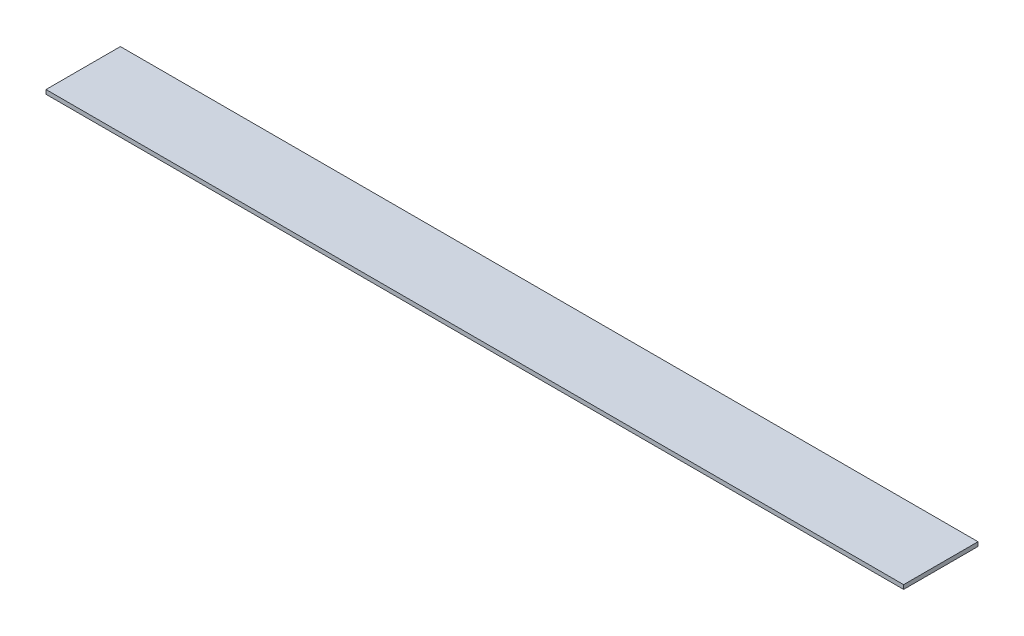
ISO-10303-21;
HEADER;
FILE_DESCRIPTION(('STEP AP214'),'2;1');
FILE_NAME('part.step','',(''),(''),'','','');
FILE_SCHEMA(('AUTOMOTIVE_DESIGN { 1 0 10303 214 1 1 1 1 }'));
ENDSEC;
DATA;
#1=APPLICATION_CONTEXT('core data for automotive mechanical design processes');
#2=APPLICATION_PROTOCOL_DEFINITION('international standard','automotive_design',2000,#1);
#3=PRODUCT_CONTEXT('',#1,'mechanical');
#4=PRODUCT('Part','Part','',(#3));
#5=PRODUCT_RELATED_PRODUCT_CATEGORY('part','',(#4));
#6=PRODUCT_DEFINITION_FORMATION('','',#4);
#7=PRODUCT_DEFINITION_CONTEXT('part definition',#1,'design');
#8=PRODUCT_DEFINITION('design','',#6,#7);
#9=PRODUCT_DEFINITION_SHAPE('','',#8);
#10=(LENGTH_UNIT() NAMED_UNIT(*) SI_UNIT(.MILLI.,.METRE.));
#11=(NAMED_UNIT(*) PLANE_ANGLE_UNIT() SI_UNIT($,.RADIAN.));
#12=(NAMED_UNIT(*) SI_UNIT($,.STERADIAN.) SOLID_ANGLE_UNIT());
#13=UNCERTAINTY_MEASURE_WITH_UNIT(LENGTH_MEASURE(1.E-05),#10,'distance_accuracy_value','');
#14=(GEOMETRIC_REPRESENTATION_CONTEXT(3) GLOBAL_UNCERTAINTY_ASSIGNED_CONTEXT((#13)) GLOBAL_UNIT_ASSIGNED_CONTEXT((#10,
#11,#12)) REPRESENTATION_CONTEXT('',''));
#15=CARTESIAN_POINT('',(0.,0.,0.));
#16=DIRECTION('',(0.,0.,1.));
#17=DIRECTION('',(1.,0.,0.));
#18=AXIS2_PLACEMENT_3D('',#15,#16,#17);
#19=CARTESIAN_POINT('',(0.,1.9,0.));
#20=DIRECTION('',(1.,0.,0.));
#21=DIRECTION('',(0.,0.,-1.));
#22=AXIS2_PLACEMENT_3D('',#19,#20,#21);
#23=PLANE('',#22);
#24=DIRECTION('',(0.,0.,1.));
#25=VECTOR('',#24,1.);
#26=CARTESIAN_POINT('',(0.,0.,0.));
#27=LINE('',#26,#25);
#28=CARTESIAN_POINT('',(0.,0.,-34.));
#29=VERTEX_POINT('',#28);
#30=CARTESIAN_POINT('',(0.,0.,0.));
#31=VERTEX_POINT('',#30);
#32=EDGE_CURVE('E100',#29,#31,#27,.T.);
#33=ORIENTED_EDGE('',*,*,#32,.T.);
#34=DIRECTION('',(0.,-1.,0.));
#35=VECTOR('',#34,1.);
#36=CARTESIAN_POINT('',(0.,1.9,0.));
#37=LINE('',#36,#35);
#38=CARTESIAN_POINT('',(0.,1.9,0.));
#39=VERTEX_POINT('',#38);
#40=EDGE_CURVE('E11',#39,#31,#37,.T.);
#41=ORIENTED_EDGE('',*,*,#40,.F.);
#42=DIRECTION('',(0.,0.,1.));
#43=VECTOR('',#42,1.);
#44=CARTESIAN_POINT('',(0.,1.9,0.));
#45=LINE('',#44,#43);
#46=CARTESIAN_POINT('',(0.,1.9,-34.));
#47=VERTEX_POINT('',#46);
#48=EDGE_CURVE('E88',#47,#39,#45,.T.);
#49=ORIENTED_EDGE('',*,*,#48,.F.);
#50=DIRECTION('',(0.,-1.,0.));
#51=VECTOR('',#50,1.);
#52=CARTESIAN_POINT('',(0.,1.9,-34.));
#53=LINE('',#52,#51);
#54=EDGE_CURVE('E96',#47,#29,#53,.T.);
#55=ORIENTED_EDGE('',*,*,#54,.T.);
#56=EDGE_LOOP('',(#33,#41,#49,#55));
#57=FACE_BOUND('',#56,.T.);
#58=ADVANCED_FACE('F37',(#57),#23,.F.);
#59=CARTESIAN_POINT('',(0.,1.9,0.));
#60=DIRECTION('',(0.,0.,-1.));
#61=DIRECTION('',(-1.,0.,0.));
#62=AXIS2_PLACEMENT_3D('',#59,#60,#61);
#63=PLANE('',#62);
#64=DIRECTION('',(1.,0.,0.));
#65=VECTOR('',#64,1.);
#66=CARTESIAN_POINT('',(0.,0.,0.));
#67=LINE('',#66,#65);
#68=CARTESIAN_POINT('',(392.,0.,0.));
#69=VERTEX_POINT('',#68);
#70=EDGE_CURVE('E92',#31,#69,#67,.T.);
#71=ORIENTED_EDGE('',*,*,#70,.T.);
#72=DIRECTION('',(0.,-1.,0.));
#73=VECTOR('',#72,1.);
#74=CARTESIAN_POINT('',(392.,1.9,0.));
#75=LINE('',#74,#73);
#76=CARTESIAN_POINT('',(392.,1.9,0.));
#77=VERTEX_POINT('',#76);
#78=EDGE_CURVE('E45',#77,#69,#75,.T.);
#79=ORIENTED_EDGE('',*,*,#78,.F.);
#80=DIRECTION('',(1.,0.,0.));
#81=VECTOR('',#80,1.);
#82=CARTESIAN_POINT('',(0.,1.9,0.));
#83=LINE('',#82,#81);
#84=EDGE_CURVE('E83',#39,#77,#83,.T.);
#85=ORIENTED_EDGE('',*,*,#84,.F.);
#86=ORIENTED_EDGE('',*,*,#40,.T.);
#87=EDGE_LOOP('',(#71,#79,#85,#86));
#88=FACE_BOUND('',#87,.T.);
#89=ADVANCED_FACE('F91',(#88),#63,.F.);
#90=CARTESIAN_POINT('',(392.,1.9,0.));
#91=DIRECTION('',(-1.,0.,0.));
#92=DIRECTION('',(0.,0.,1.));
#93=AXIS2_PLACEMENT_3D('',#90,#91,#92);
#94=PLANE('',#93);
#95=DIRECTION('',(0.,0.,-1.));
#96=VECTOR('',#95,1.);
#97=CARTESIAN_POINT('',(392.,0.,0.));
#98=LINE('',#97,#96);
#99=CARTESIAN_POINT('',(392.,0.,-34.));
#100=VERTEX_POINT('',#99);
#101=EDGE_CURVE('E70',#69,#100,#98,.T.);
#102=ORIENTED_EDGE('',*,*,#101,.T.);
#103=DIRECTION('',(0.,-1.,0.));
#104=VECTOR('',#103,1.);
#105=CARTESIAN_POINT('',(392.,1.9,-34.));
#106=LINE('',#105,#104);
#107=CARTESIAN_POINT('',(392.,1.9,-34.));
#108=VERTEX_POINT('',#107);
#109=EDGE_CURVE('E93',#108,#100,#106,.T.);
#110=ORIENTED_EDGE('',*,*,#109,.F.);
#111=DIRECTION('',(0.,0.,-1.));
#112=VECTOR('',#111,1.);
#113=CARTESIAN_POINT('',(392.,1.9,0.));
#114=LINE('',#113,#112);
#115=EDGE_CURVE('E86',#77,#108,#114,.T.);
#116=ORIENTED_EDGE('',*,*,#115,.F.);
#117=ORIENTED_EDGE('',*,*,#78,.T.);
#118=EDGE_LOOP('',(#102,#110,#116,#117));
#119=FACE_BOUND('',#118,.T.);
#120=ADVANCED_FACE('F94',(#119),#94,.F.);
#121=CARTESIAN_POINT('',(0.,1.9,-34.));
#122=DIRECTION('',(0.,0.,1.));
#123=DIRECTION('',(1.,0.,0.));
#124=AXIS2_PLACEMENT_3D('',#121,#122,#123);
#125=PLANE('',#124);
#126=DIRECTION('',(-1.,0.,0.));
#127=VECTOR('',#126,1.);
#128=CARTESIAN_POINT('',(0.,0.,-34.));
#129=LINE('',#128,#127);
#130=EDGE_CURVE('E76',#100,#29,#129,.T.);
#131=ORIENTED_EDGE('',*,*,#130,.T.);
#132=ORIENTED_EDGE('',*,*,#54,.F.);
#133=DIRECTION('',(-1.,0.,0.));
#134=VECTOR('',#133,1.);
#135=CARTESIAN_POINT('',(0.,1.9,-34.));
#136=LINE('',#135,#134);
#137=EDGE_CURVE('E53',#108,#47,#136,.T.);
#138=ORIENTED_EDGE('',*,*,#137,.F.);
#139=ORIENTED_EDGE('',*,*,#109,.T.);
#140=EDGE_LOOP('',(#131,#132,#138,#139));
#141=FACE_BOUND('',#140,.T.);
#142=ADVANCED_FACE('F107',(#141),#125,.F.);
#143=CARTESIAN_POINT('',(0.,1.9,0.));
#144=DIRECTION('',(0.,-1.,0.));
#145=DIRECTION('',(0.,0.,-1.));
#146=AXIS2_PLACEMENT_3D('',#143,#144,#145);
#147=PLANE('',#146);
#148=ORIENTED_EDGE('',*,*,#48,.T.);
#149=ORIENTED_EDGE('',*,*,#84,.T.);
#150=ORIENTED_EDGE('',*,*,#115,.T.);
#151=ORIENTED_EDGE('',*,*,#137,.T.);
#152=EDGE_LOOP('',(#148,#149,#150,#151));
#153=FACE_BOUND('',#152,.T.);
#154=ADVANCED_FACE('F84',(#153),#147,.F.);
#155=CARTESIAN_POINT('',(0.,0.,0.));
#156=DIRECTION('',(0.,-1.,0.));
#157=DIRECTION('',(0.,0.,-1.));
#158=AXIS2_PLACEMENT_3D('',#155,#156,#157);
#159=PLANE('',#158);
#160=ORIENTED_EDGE('',*,*,#32,.F.);
#161=ORIENTED_EDGE('',*,*,#130,.F.);
#162=ORIENTED_EDGE('',*,*,#101,.F.);
#163=ORIENTED_EDGE('',*,*,#70,.F.);
#164=EDGE_LOOP('',(#160,#161,#162,#163));
#165=FACE_BOUND('',#164,.T.);
#166=ADVANCED_FACE('F110',(#165),#159,.T.);
#167=CLOSED_SHELL('',(#58,#89,#120,#142,#154,#166));
#168=MANIFOLD_SOLID_BREP('B2',#167);
#169=ADVANCED_BREP_SHAPE_REPRESENTATION('',(#18,#168),#14);
#170=SHAPE_DEFINITION_REPRESENTATION(#9,#169);
ENDSEC;
END-ISO-10303-21;
